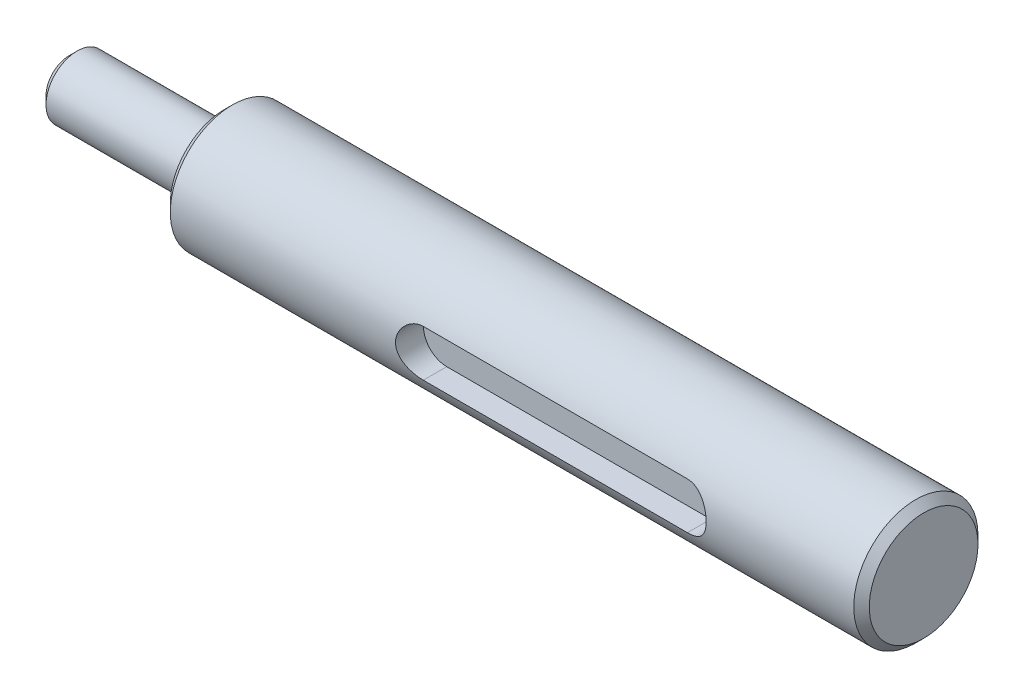
ISO-10303-21;
HEADER;
FILE_DESCRIPTION(('STEP AP214'),'2;1');
FILE_NAME('part.step','',(''),(''),'','','');
FILE_SCHEMA(('AUTOMOTIVE_DESIGN { 1 0 10303 214 1 1 1 1 }'));
ENDSEC;
DATA;
#1=APPLICATION_CONTEXT('core data for automotive mechanical design processes');
#2=APPLICATION_PROTOCOL_DEFINITION('international standard','automotive_design',2000,#1);
#3=PRODUCT_CONTEXT('',#1,'mechanical');
#4=PRODUCT('Part','Part','',(#3));
#5=PRODUCT_RELATED_PRODUCT_CATEGORY('part','',(#4));
#6=PRODUCT_DEFINITION_FORMATION('','',#4);
#7=PRODUCT_DEFINITION_CONTEXT('part definition',#1,'design');
#8=PRODUCT_DEFINITION('design','',#6,#7);
#9=PRODUCT_DEFINITION_SHAPE('','',#8);
#10=(LENGTH_UNIT() NAMED_UNIT(*) SI_UNIT(.MILLI.,.METRE.));
#11=(NAMED_UNIT(*) PLANE_ANGLE_UNIT() SI_UNIT($,.RADIAN.));
#12=(NAMED_UNIT(*) SI_UNIT($,.STERADIAN.) SOLID_ANGLE_UNIT());
#13=UNCERTAINTY_MEASURE_WITH_UNIT(LENGTH_MEASURE(1.E-05),#10,'distance_accuracy_value','');
#14=(GEOMETRIC_REPRESENTATION_CONTEXT(3) GLOBAL_UNCERTAINTY_ASSIGNED_CONTEXT((#13)) GLOBAL_UNIT_ASSIGNED_CONTEXT((#10,
#11,#12)) REPRESENTATION_CONTEXT('',''));
#15=CARTESIAN_POINT('',(0.,0.,0.));
#16=DIRECTION('',(0.,0.,1.));
#17=DIRECTION('',(1.,0.,0.));
#18=AXIS2_PLACEMENT_3D('',#15,#16,#17);
#19=CARTESIAN_POINT('',(-10.,0.,0.));
#20=DIRECTION('',(1.,0.,0.));
#21=DIRECTION('',(0.,0.,-1.));
#22=AXIS2_PLACEMENT_3D('',#19,#20,#21);
#23=PLANE('',#22);
#24=CARTESIAN_POINT('',(-10.,0.,0.));
#25=DIRECTION('',(1.,0.,0.));
#26=DIRECTION('',(0.,0.,-1.));
#27=AXIS2_PLACEMENT_3D('',#24,#25,#26);
#28=CIRCLE('',#27,1.5);
#29=CARTESIAN_POINT('',(-10.,0.,-1.5));
#30=VERTEX_POINT('',#29);
#31=EDGE_CURVE('E209',#30,#30,#28,.T.);
#32=ORIENTED_EDGE('',*,*,#31,.F.);
#33=EDGE_LOOP('',(#32));
#34=FACE_BOUND('',#33,.T.);
#35=ADVANCED_FACE('F16',(#34),#23,.F.);
#36=CARTESIAN_POINT('',(-10.,0.,0.));
#37=DIRECTION('',(1.,0.,0.));
#38=DIRECTION('',(0.,0.,-1.));
#39=AXIS2_PLACEMENT_3D('',#36,#37,#38);
#40=CONICAL_SURFACE('',#39,1.5,0.785398163397448);
#41=CARTESIAN_POINT('',(-9.5,0.,0.));
#42=DIRECTION('',(1.,0.,0.));
#43=DIRECTION('',(0.,0.,-1.));
#44=AXIS2_PLACEMENT_3D('',#41,#42,#43);
#45=CIRCLE('',#44,2.);
#46=CARTESIAN_POINT('',(-9.5,0.,-2.));
#47=VERTEX_POINT('',#46);
#48=EDGE_CURVE('E201',#47,#47,#45,.T.);
#49=ORIENTED_EDGE('',*,*,#48,.F.);
#50=EDGE_LOOP('',(#49));
#51=FACE_BOUND('',#50,.T.);
#52=ORIENTED_EDGE('',*,*,#31,.T.);
#53=EDGE_LOOP('',(#52));
#54=FACE_BOUND('',#53,.T.);
#55=ADVANCED_FACE('F166',(#51,#54),#40,.T.);
#56=CARTESIAN_POINT('',(45.,0.,0.));
#57=DIRECTION('',(1.,0.,0.));
#58=DIRECTION('',(0.,0.,-1.));
#59=AXIS2_PLACEMENT_3D('',#56,#57,#58);
#60=CYLINDRICAL_SURFACE('',#59,2.);
#61=CARTESIAN_POINT('',(-0.2,0.,0.));
#62=DIRECTION('',(1.,0.,0.));
#63=DIRECTION('',(0.,0.,-1.));
#64=AXIS2_PLACEMENT_3D('',#61,#62,#63);
#65=CIRCLE('',#64,2.);
#66=CARTESIAN_POINT('',(-0.2,0.,-2.));
#67=VERTEX_POINT('',#66);
#68=EDGE_CURVE('E197',#67,#67,#65,.T.);
#69=ORIENTED_EDGE('',*,*,#68,.F.);
#70=EDGE_LOOP('',(#69));
#71=FACE_BOUND('',#70,.T.);
#72=ORIENTED_EDGE('',*,*,#48,.T.);
#73=EDGE_LOOP('',(#72));
#74=FACE_BOUND('',#73,.T.);
#75=ADVANCED_FACE('F172',(#71,#74),#60,.T.);
#76=CARTESIAN_POINT('',(-0.200000000000016,0.,0.));
#77=DIRECTION('',(1.,0.,0.));
#78=DIRECTION('',(0.,0.,-1.));
#79=AXIS2_PLACEMENT_3D('',#76,#77,#78);
#80=TOROIDAL_SURFACE('',#79,2.2,0.200000000000016);
#81=CARTESIAN_POINT('',(0.,0.,0.));
#82=DIRECTION('',(1.,0.,0.));
#83=DIRECTION('',(0.,0.,-1.));
#84=AXIS2_PLACEMENT_3D('',#81,#82,#83);
#85=CIRCLE('',#84,2.2);
#86=CARTESIAN_POINT('',(0.,0.,-2.2));
#87=VERTEX_POINT('',#86);
#88=EDGE_CURVE('E196',#87,#87,#85,.T.);
#89=ORIENTED_EDGE('',*,*,#88,.F.);
#90=EDGE_LOOP('',(#89));
#91=FACE_BOUND('',#90,.T.);
#92=ORIENTED_EDGE('',*,*,#68,.T.);
#93=EDGE_LOOP('',(#92));
#94=FACE_BOUND('',#93,.T.);
#95=ADVANCED_FACE('F179',(#91,#94),#80,.F.);
#96=CARTESIAN_POINT('',(0.,2.2,0.));
#97=DIRECTION('',(1.,0.,0.));
#98=DIRECTION('',(0.,0.,-1.));
#99=AXIS2_PLACEMENT_3D('',#96,#97,#98);
#100=PLANE('',#99);
#101=CARTESIAN_POINT('',(0.,0.,0.));
#102=DIRECTION('',(1.,0.,0.));
#103=DIRECTION('',(0.,0.,-1.));
#104=AXIS2_PLACEMENT_3D('',#101,#102,#103);
#105=CIRCLE('',#104,3.5);
#106=CARTESIAN_POINT('',(0.,0.,-3.5));
#107=VERTEX_POINT('',#106);
#108=EDGE_CURVE('E193',#107,#107,#105,.T.);
#109=ORIENTED_EDGE('',*,*,#108,.F.);
#110=EDGE_LOOP('',(#109));
#111=FACE_BOUND('',#110,.T.);
#112=ORIENTED_EDGE('',*,*,#88,.T.);
#113=EDGE_LOOP('',(#112));
#114=FACE_BOUND('',#113,.T.);
#115=ADVANCED_FACE('F182',(#111,#114),#100,.F.);
#116=CARTESIAN_POINT('',(0.,0.,0.));
#117=DIRECTION('',(1.,0.,0.));
#118=DIRECTION('',(0.,0.,-1.));
#119=AXIS2_PLACEMENT_3D('',#116,#117,#118);
#120=CONICAL_SURFACE('',#119,3.5,0.785398163397448);
#121=CARTESIAN_POINT('',(0.5,0.,0.));
#122=DIRECTION('',(1.,0.,0.));
#123=DIRECTION('',(0.,0.,-1.));
#124=AXIS2_PLACEMENT_3D('',#121,#122,#123);
#125=CIRCLE('',#124,4.);
#126=CARTESIAN_POINT('',(0.5,0.,-4.));
#127=VERTEX_POINT('',#126);
#128=EDGE_CURVE('E89',#127,#127,#125,.T.);
#129=ORIENTED_EDGE('',*,*,#128,.F.);
#130=EDGE_LOOP('',(#129));
#131=FACE_BOUND('',#130,.T.);
#132=ORIENTED_EDGE('',*,*,#108,.T.);
#133=EDGE_LOOP('',(#132));
#134=FACE_BOUND('',#133,.T.);
#135=ADVANCED_FACE('F110',(#131,#134),#120,.T.);
#136=CARTESIAN_POINT('',(45.,0.,0.));
#137=DIRECTION('',(1.,0.,0.));
#138=DIRECTION('',(0.,0.,-1.));
#139=AXIS2_PLACEMENT_3D('',#136,#137,#138);
#140=CYLINDRICAL_SURFACE('',#139,4.);
#141=CARTESIAN_POINT('',(44.5,0.,0.));
#142=DIRECTION('',(1.,0.,0.));
#143=DIRECTION('',(0.,0.,-1.));
#144=AXIS2_PLACEMENT_3D('',#141,#142,#143);
#145=CIRCLE('',#144,4.);
#146=CARTESIAN_POINT('',(44.5,0.,-4.));
#147=VERTEX_POINT('',#146);
#148=EDGE_CURVE('E86',#147,#147,#145,.T.);
#149=ORIENTED_EDGE('',*,*,#148,.F.);
#150=EDGE_LOOP('',(#149));
#151=FACE_BOUND('',#150,.T.);
#152=DIRECTION('',(1.,0.,0.));
#153=VECTOR('',#152,1.);
#154=CARTESIAN_POINT('',(16.5,1.5,3.70809924354783));
#155=LINE('',#154,#153);
#156=CARTESIAN_POINT('',(16.5,1.5,3.70809924354783));
#157=VERTEX_POINT('',#156);
#158=CARTESIAN_POINT('',(33.5,1.5,3.70809924354783));
#159=VERTEX_POINT('',#158);
#160=EDGE_CURVE('E70',#157,#159,#155,.T.);
#161=ORIENTED_EDGE('',*,*,#160,.T.);
#162=CARTESIAN_POINT('',(33.5,1.5,3.70809924354783));
#163=CARTESIAN_POINT('',(33.5199450486581,1.50000089736899,3.70809856452194));
#164=CARTESIAN_POINT('',(33.5398904816375,1.49961124737892,3.70825648961619));
#165=CARTESIAN_POINT('',(33.5796340399623,1.49804869432538,3.70888816765675));
#166=CARTESIAN_POINT('',(33.5994323661552,1.49688017499157,3.70936015294496));
#167=CARTESIAN_POINT('',(33.6388825387993,1.49376374507018,3.71061619100091));
#168=CARTESIAN_POINT('',(33.6585346560803,1.4918187913755,3.71139905977317));
#169=CARTESIAN_POINT('',(33.697693113869,1.48715414794438,3.71327064511375));
#170=CARTESIAN_POINT('',(33.7171996639137,1.48443597633218,3.71435876230468));
#171=CARTESIAN_POINT('',(33.7560679004188,1.47822866178049,3.71683348672789));
#172=CARTESIAN_POINT('',(33.7754296059174,1.47473962207196,3.71822005399253));
#173=CARTESIAN_POINT('',(33.8140091478965,1.46699380876062,3.72128291475121));
#174=CARTESIAN_POINT('',(33.8332266930134,1.46273577328565,3.72295968425695));
#175=CARTESIAN_POINT('',(33.8715191427874,1.4534548854513,3.72659278835215));
#176=CARTESIAN_POINT('',(33.8905933400785,1.44842948130874,3.72855005430852));
#177=CARTESIAN_POINT('',(33.9286000094495,1.43761528232262,3.73273305403726));
#178=CARTESIAN_POINT('',(33.9475312683034,1.43182273696508,3.73496010187578));
#179=CARTESIAN_POINT('',(33.985168329086,1.41950699430011,3.73965820034778));
#180=CARTESIAN_POINT('',(34.0038735749353,1.41298229017736,3.74212975289855));
#181=CARTESIAN_POINT('',(34.0408951012299,1.39925302398884,3.74728494647122));
#182=CARTESIAN_POINT('',(34.0592128592872,1.39205202586604,3.7499674647739));
#183=CARTESIAN_POINT('',(34.0954584304663,1.37697300078356,3.75553054686646));
#184=CARTESIAN_POINT('',(34.1133874065149,1.36909749464294,3.75841036585242));
#185=CARTESIAN_POINT('',(34.1488594219785,1.35267293462389,3.7643528053963));
#186=CARTESIAN_POINT('',(34.1664031512844,1.34412523635835,3.76741505516591));
#187=CARTESIAN_POINT('',(34.2011085613983,1.32635906598519,3.77370645233928));
#188=CARTESIAN_POINT('',(34.2182703814861,1.31714084382769,3.7769355374234));
#189=CARTESIAN_POINT('',(34.2522159417151,1.29803631474787,3.7835438408551));
#190=CARTESIAN_POINT('',(34.26899920863,1.28814922738827,3.78692323295133));
#191=CARTESIAN_POINT('',(34.3021918757246,1.26770971937128,3.7938145309543));
#192=CARTESIAN_POINT('',(34.3186001469192,1.25715557808746,3.79732676932226));
#193=CARTESIAN_POINT('',(34.3510463192925,1.23538373386121,3.80446563644074));
#194=CARTESIAN_POINT('',(34.3670824081849,1.22416346725929,3.80809267818527));
#195=CARTESIAN_POINT('',(34.3987478822215,1.20109551185277,3.81543136818895));
#196=CARTESIAN_POINT('',(34.4143760025261,1.18924615383918,3.81914322495519));
#197=CARTESIAN_POINT('',(34.4450895144621,1.16501610604786,3.82660390758159));
#198=CARTESIAN_POINT('',(34.4601770051164,1.15263800487171,3.83035249657578));
#199=CARTESIAN_POINT('',(34.4897984519701,1.12735416450796,3.83786996434399));
#200=CARTESIAN_POINT('',(34.5043342455066,1.11445054116477,3.84163871718287));
#201=CARTESIAN_POINT('',(34.5328542980744,1.08811510673159,3.84918078191495));
#202=CARTESIAN_POINT('',(34.5468397407188,1.07468456901714,3.85295406374682));
#203=CARTESIAN_POINT('',(34.5742605789496,1.04729419068475,3.86048914558244));
#204=CARTESIAN_POINT('',(34.5876964388207,1.03333481686828,3.86425095268487));
#205=CARTESIAN_POINT('',(34.6140197999485,1.00488598186168,3.87174646042746));
#206=CARTESIAN_POINT('',(34.6269069906222,0.990396228849816,3.87548014418909));
#207=CARTESIAN_POINT('',(34.6521347898805,0.960886031135332,3.88290226084419));
#208=CARTESIAN_POINT('',(34.6644742718622,0.94586459734425,3.88659059012124));
#209=CARTESIAN_POINT('',(34.6886081831962,0.915290426695448,3.89390437994279));
#210=CARTESIAN_POINT('',(34.7004006430826,0.899736075080753,3.8975295877787));
#211=CARTESIAN_POINT('',(34.7234416800251,0.868098510736872,3.90469835573684));
#212=CARTESIAN_POINT('',(34.7346875164945,0.852013200770794,3.90824146547409));
#213=CARTESIAN_POINT('',(34.7565513756601,0.819434445163634,3.91520168747571));
#214=CARTESIAN_POINT('',(34.7671704034479,0.802941716594649,3.9186189979541));
#215=CARTESIAN_POINT('',(34.7877224622443,0.769614045226761,3.92530019992182));
#216=CARTESIAN_POINT('',(34.7976584918031,0.752781082748375,3.92856473884158));
#217=CARTESIAN_POINT('',(34.8168425606811,0.718772951170971,3.93492867875656));
#218=CARTESIAN_POINT('',(34.8260927865872,0.701599112488884,3.93802859478895));
#219=CARTESIAN_POINT('',(34.8439026880918,0.666908972708808,3.94405143664559));
#220=CARTESIAN_POINT('',(34.852463650375,0.649393389287445,3.94697468958522));
#221=CARTESIAN_POINT('',(34.8688927450906,0.61401987150133,3.9526320685094));
#222=CARTESIAN_POINT('',(34.8767611844706,0.596162093125522,3.95536627816737));
#223=CARTESIAN_POINT('',(34.8918029152238,0.560104476457852,3.96063319255055));
#224=CARTESIAN_POINT('',(34.8989754689702,0.541904299099427,3.96316568295882));
#225=CARTESIAN_POINT('',(34.9126234327671,0.505162482760767,3.96801652126187));
#226=CARTESIAN_POINT('',(34.9190970133416,0.486620089666016,3.97033430504127));
#227=CARTESIAN_POINT('',(34.9313441359663,0.449194437154995,3.97474286117349));
#228=CARTESIAN_POINT('',(34.9371147247672,0.430310098358728,3.97683267222212));
#229=CARTESIAN_POINT('',(34.9479529129768,0.392214942025615,3.98077077145582));
#230=CARTESIAN_POINT('',(34.9530169322277,0.373002978722608,3.98261782705184));
#231=CARTESIAN_POINT('',(34.9623847321422,0.334431890298367,3.98604177851591));
#232=CARTESIAN_POINT('',(34.9666907415375,0.315073377267811,3.98761946596504));
#233=CARTESIAN_POINT('',(34.9745202346462,0.276269646843665,3.99049518825004));
#234=CARTESIAN_POINT('',(34.9780471733009,0.256825218933224,3.9917944569881));
#235=CARTESIAN_POINT('',(34.9843190743405,0.217853921584761,3.99411060862672));
#236=CARTESIAN_POINT('',(34.9870663519509,0.198327474743152,3.99512832736641));
#237=CARTESIAN_POINT('',(34.991778490505,0.159196116709768,3.99687873484046));
#238=CARTESIAN_POINT('',(34.9937444694046,0.139591358470514,3.99761183080508));
#239=CARTESIAN_POINT('',(34.9968939152741,0.100307414369995,3.99879039637172));
#240=CARTESIAN_POINT('',(34.9980772619261,0.0806282175324005,3.99923582174851));
#241=CARTESIAN_POINT('',(34.9996612789958,0.0411993967179798,3.99983650156494));
#242=CARTESIAN_POINT('',(35.0000605737182,0.0214497097566775,3.99999124595597));
#243=CARTESIAN_POINT('',(35.0000764514507,-0.0181161360870476,4.00000805977239));
#244=CARTESIAN_POINT('',(34.9996904105448,-0.0379322962314546,3.9998691479908));
#245=CARTESIAN_POINT('',(34.9981351879993,-0.0776270725407904,3.99929618608449));
#246=CARTESIAN_POINT('',(34.9969621631572,-0.0975055163973702,3.99886068743215));
#247=CARTESIAN_POINT('',(34.9938416169736,-0.137223090792668,3.99769497621722));
#248=CARTESIAN_POINT('',(34.9918929268459,-0.157062116389304,3.99696431887947));
#249=CARTESIAN_POINT('',(34.9872267080505,-0.196541972565766,3.99521712031409));
#250=CARTESIAN_POINT('',(34.9845128479092,-0.216183296591103,3.99420194332114));
#251=CARTESIAN_POINT('',(34.9783204495627,-0.255262680106333,3.99189464356884));
#252=CARTESIAN_POINT('',(34.9748444385816,-0.274701194029206,3.99060343644653));
#253=CARTESIAN_POINT('',(34.9671323027238,-0.313372246727262,3.98775288734361));
#254=CARTESIAN_POINT('',(34.9628974884008,-0.33260508098722,3.98619400785915));
#255=CARTESIAN_POINT('',(34.9536721935787,-0.370862383722415,3.98281681696109));
#256=CARTESIAN_POINT('',(34.9486818310458,-0.389886884229085,3.98099854604965));
#257=CARTESIAN_POINT('',(34.9379498249106,-0.427725432529754,3.97711116041995));
#258=CARTESIAN_POINT('',(34.9322071519953,-0.446539152938039,3.97504170231701));
#259=CARTESIAN_POINT('',(34.9199750877886,-0.483954473328714,3.97066038210852));
#260=CARTESIAN_POINT('',(34.9134835854342,-0.50255530269457,3.9683478364134));
#261=CARTESIAN_POINT('',(34.8997574579093,-0.539543047472781,3.96348871229549));
#262=CARTESIAN_POINT('',(34.8925197183396,-0.557928677839426,3.96094115814073));
#263=CARTESIAN_POINT('',(34.8773414959637,-0.594405549589216,3.95563170066709));
#264=CARTESIAN_POINT('',(34.8694000780712,-0.612496360254044,3.9528695127492));
#265=CARTESIAN_POINT('',(34.8528674043422,-0.648249633234827,3.94716336986651));
#266=CARTESIAN_POINT('',(34.8442792013246,-0.665913644859606,3.94422027954586));
#267=CARTESIAN_POINT('',(34.8264554507235,-0.700811779758493,3.93816905470476));
#268=CARTESIAN_POINT('',(34.8172220153192,-0.718047076374335,3.93506146609069));
#269=CARTESIAN_POINT('',(34.7981112192282,-0.752089365050631,3.92869710372997));
#270=CARTESIAN_POINT('',(34.7882349737999,-0.768897032077975,3.92544059113624));
#271=CARTESIAN_POINT('',(34.7678415252772,-0.802085862639763,3.91879377204522));
#272=CARTESIAN_POINT('',(34.7573244806554,-0.818467130206,3.91540349870009));
#273=CARTESIAN_POINT('',(34.7356524065632,-0.850805326183809,3.90850405870109));
#274=CARTESIAN_POINT('',(34.7244966335254,-0.866761726994714,3.90499475549921));
#275=CARTESIAN_POINT('',(34.7015502349587,-0.898252885828872,3.89787160362012));
#276=CARTESIAN_POINT('',(34.6897580330447,-0.913786438681743,3.89425750667078));
#277=CARTESIAN_POINT('',(34.6655409008703,-0.944434088717742,3.88693883295457));
#278=CARTESIAN_POINT('',(34.6531136381786,-0.959546269436205,3.88323395321616));
#279=CARTESIAN_POINT('',(34.627672438963,-0.989309289100827,3.87575837909199));
#280=CARTESIAN_POINT('',(34.6146573083014,-1.00395907593639,3.871987561245));
#281=CARTESIAN_POINT('',(34.588139422907,-1.03267729410848,3.86442713168466));
#282=CARTESIAN_POINT('',(34.5746391666374,-1.04674807495339,3.86063768445456));
#283=CARTESIAN_POINT('',(34.54715196937,-1.07430126473969,3.85306114950972));
#284=CARTESIAN_POINT('',(34.533166971937,-1.08778562323666,3.84927410312045));
#285=CARTESIAN_POINT('',(34.5047090660023,-1.11416741510404,3.84172081417597));
#286=CARTESIAN_POINT('',(34.4902373253175,-1.12706610004442,3.83795454398939));
#287=CARTESIAN_POINT('',(34.4608040197574,-1.15227769663887,3.83046066755321));
#288=CARTESIAN_POINT('',(34.4458428688493,-1.16459108279046,3.82673303196849));
#289=CARTESIAN_POINT('',(34.4154289717717,-1.18863359128592,3.81933351452422));
#290=CARTESIAN_POINT('',(34.3999759214246,-1.20036234013546,3.81566166932152));
#291=CARTESIAN_POINT('',(34.368576421583,-1.22323729974505,3.80839006097582));
#292=CARTESIAN_POINT('',(34.3526290012407,-1.23438223123663,3.80479046598179));
#293=CARTESIAN_POINT('',(34.3202387020509,-1.25609112912262,3.79767903037953));
#294=CARTESIAN_POINT('',(34.3037942502823,-1.26665286663717,3.79416755112899));
#295=CARTESIAN_POINT('',(34.2704103848882,-1.28719699769113,3.78724728210048));
#296=CARTESIAN_POINT('',(34.2534689222676,-1.2971762608498,3.78383908744704));
#297=CARTESIAN_POINT('',(34.2192247413795,-1.31647638577798,3.77716744893967));
#298=CARTESIAN_POINT('',(34.201922662223,-1.32579830211568,3.77390377651309));
#299=CARTESIAN_POINT('',(34.1670349489381,-1.3437262453162,3.76755753365013));
#300=CARTESIAN_POINT('',(34.149451249596,-1.3523357326521,3.76447411213181));
#301=CARTESIAN_POINT('',(34.1139987115551,-1.36883818369329,3.75850485354708));
#302=CARTESIAN_POINT('',(34.0961311694597,-1.37673368203501,3.75561832726538));
#303=CARTESIAN_POINT('',(34.0601088391496,-1.39180678831751,3.7500584353093));
#304=CARTESIAN_POINT('',(34.0419547469106,-1.39898589533773,3.74738462699791));
#305=CARTESIAN_POINT('',(34.0053573089996,-1.41262495386334,3.74226452584361));
#306=CARTESIAN_POINT('',(33.9869141141335,-1.41908526695052,3.73981811871176));
#307=CARTESIAN_POINT('',(33.9497363434258,-1.43128512703357,3.73516606971231));
#308=CARTESIAN_POINT('',(33.9310014487813,-1.43702381258892,3.73296071600434));
#309=CARTESIAN_POINT('',(33.8932381684067,-1.44777906926282,3.72880263679225));
#310=CARTESIAN_POINT('',(33.8742090874566,-1.45279349121153,3.72685066483768));
#311=CARTESIAN_POINT('',(33.8358548924361,-1.46209677665177,3.72321072599105));
#312=CARTESIAN_POINT('',(33.8165288125707,-1.46638215334576,3.72152403058298));
#313=CARTESIAN_POINT('',(33.7775904911469,-1.47422803480183,3.71842299352297));
#314=CARTESIAN_POINT('',(33.7579772385128,-1.47778417267152,3.71701029522605));
#315=CARTESIAN_POINT('',(33.7186194761666,-1.48411781325269,3.71448596230769));
#316=CARTESIAN_POINT('',(33.6988750636707,-1.48689583835951,3.71337412571621));
#317=CARTESIAN_POINT('',(33.659306602124,-1.49165778414401,3.71146380638784));
#318=CARTESIAN_POINT('',(33.6394827236396,-1.49364292730046,3.7106648412979));
#319=CARTESIAN_POINT('',(33.5997555254359,-1.49682013108245,3.70938439685059));
#320=CARTESIAN_POINT('',(33.5798521844114,-1.49801196231125,3.70890300932537));
#321=CARTESIAN_POINT('',(33.5399659296075,-1.4996032574204,3.70825972258939));
#322=CARTESIAN_POINT('',(33.5199829367162,-1.50000101677856,3.70809851065828));
#323=CARTESIAN_POINT('',(33.5,-1.5,3.70809924354783));
#324=B_SPLINE_CURVE_WITH_KNOTS('',3,(#162,#163,#164,#165,#166,#167,#168,#169,#170,#171,#172,
#173,#174,#175,#176,#177,#178,#179,#180,#181,#182,#183,#184,#185,#186,#187,#188,#189,#190,#191,
#192,#193,#194,#195,#196,#197,#198,#199,#200,#201,#202,#203,#204,#205,#206,#207,#208,#209,#210,
#211,#212,#213,#214,#215,#216,#217,#218,#219,#220,#221,#222,#223,#224,#225,#226,#227,#228,#229,
#230,#231,#232,#233,#234,#235,#236,#237,#238,#239,#240,#241,#242,#243,#244,#245,#246,#247,#248,
#249,#250,#251,#252,#253,#254,#255,#256,#257,#258,#259,#260,#261,#262,#263,#264,#265,#266,#267,
#268,#269,#270,#271,#272,#273,#274,#275,#276,#277,#278,#279,#280,#281,#282,#283,#284,#285,#286,
#287,#288,#289,#290,#291,#292,#293,#294,#295,#296,#297,#298,#299,#300,#301,#302,#303,#304,#305,
#306,#307,#308,#309,#310,#311,#312,#313,#314,#315,#316,#317,#318,#319,#320,#321,#322,#323),
.UNSPECIFIED.,.F.,.F.,(4,2,2,2,2,2,2,2,2,2,2,2,2,2,2,2,2,2,2,2,2,2,2,2,2,2,2,2,2,2,2,2,2,2,2,2,
2,2,2,2,2,2,2,2,2,2,2,2,2,2,2,2,2,2,2,2,2,2,2,2,2,2,2,2,2,2,2,2,2,2,2,2,2,2,2,2,2,2,2,2,4),(0.,
0.0598312333103517,0.119328528938099,0.17860137031588,0.237758630163387,0.296907972750733,
0.356155272355754,0.415604063396811,0.475355035969799,0.535231315669117,0.594808090567642,
0.6541711910058,0.713417501185492,0.772641838290555,0.831936512156359,0.891390923492462,
0.951091208648317,1.01095869623459,1.07056075829167,1.12994285805385,1.18918936136678,
1.24838473383039,1.30761318096651,1.36695829052458,1.42650268446661,1.48631999630579,
1.54603862825969,1.60547567164327,1.66471423909523,1.72383952711829,1.78293847560562,
1.84209939879477,1.90141159514039,1.96096494457237,2.02080986689141,2.08047577982744,
2.13987152952181,2.19908901084421,2.25822145044738,2.31736297865517,2.37660818402172,
2.43605166097448,2.49578756129003,2.55561381554401,2.61515797905046,2.67450760758544,
2.7337557025429,2.79299455643119,2.85231532451712,2.91180761362997,2.9715590971528,
3.03139120790122,3.09095675188133,3.15033569828945,3.20961423684283,3.2688781745824,
3.32821256471929,3.38770134582774,3.44742699890183,3.50727996874194,3.56685958798459,
3.6262230343174,3.68545299716065,3.74463409384541,3.80385252602292,3.86319571190261,
3.92275190194718,3.98260322942064,4.04235624477203,4.10179951806687,4.16102272714834,
4.22011928926929,4.27918598777651,4.33832254076978,4.39763112016236,4.45721583208633,
4.51714755634882,4.57703894775652,4.63683763780492,4.69665361194096,4.7565978471323),.UNSPECIFIED.);
#325=CARTESIAN_POINT('',(33.5,-1.5,3.70809924354783));
#326=VERTEX_POINT('',#325);
#327=EDGE_CURVE('E58',#159,#326,#324,.T.);
#328=ORIENTED_EDGE('',*,*,#327,.T.);
#329=DIRECTION('',(-1.,0.,0.));
#330=VECTOR('',#329,1.);
#331=CARTESIAN_POINT('',(33.5,-1.5,3.70809924354783));
#332=LINE('',#331,#330);
#333=CARTESIAN_POINT('',(16.5,-1.5,3.70809924354783));
#334=VERTEX_POINT('',#333);
#335=EDGE_CURVE('E69',#326,#334,#332,.T.);
#336=ORIENTED_EDGE('',*,*,#335,.T.);
#337=CARTESIAN_POINT('',(16.5,-1.5,3.70809924354783));
#338=CARTESIAN_POINT('',(16.4800549513419,-1.50000089736899,3.70809856452194));
#339=CARTESIAN_POINT('',(16.4601095183624,-1.49961124737892,3.70825648961619));
#340=CARTESIAN_POINT('',(16.4203659600377,-1.49804869432538,3.70888816765675));
#341=CARTESIAN_POINT('',(16.4005676338448,-1.49688017499157,3.70936015294496));
#342=CARTESIAN_POINT('',(16.3611174612007,-1.49376374507018,3.71061619100091));
#343=CARTESIAN_POINT('',(16.3414653439197,-1.4918187913755,3.71139905977317));
#344=CARTESIAN_POINT('',(16.302306886131,-1.48715414794438,3.71327064511376));
#345=CARTESIAN_POINT('',(16.2828003360863,-1.48443597633218,3.71435876230468));
#346=CARTESIAN_POINT('',(16.2439320995812,-1.47822866178049,3.71683348672789));
#347=CARTESIAN_POINT('',(16.2245703940826,-1.47473962207196,3.71822005399253));
#348=CARTESIAN_POINT('',(16.1859908521035,-1.46699380876062,3.72128291475121));
#349=CARTESIAN_POINT('',(16.1667733069865,-1.46273577328565,3.72295968425695));
#350=CARTESIAN_POINT('',(16.1284808572126,-1.4534548854513,3.72659278835215));
#351=CARTESIAN_POINT('',(16.1094066599215,-1.44842948130874,3.72855005430852));
#352=CARTESIAN_POINT('',(16.0713999905505,-1.43761528232262,3.73273305403726));
#353=CARTESIAN_POINT('',(16.0524687316965,-1.43182273696509,3.73496010187578));
#354=CARTESIAN_POINT('',(16.014831670914,-1.41950699430011,3.73965820034778));
#355=CARTESIAN_POINT('',(15.9961264250647,-1.41298229017735,3.74212975289855));
#356=CARTESIAN_POINT('',(15.9591048987701,-1.39925302398883,3.74728494647122));
#357=CARTESIAN_POINT('',(15.9407871407128,-1.39205202586604,3.7499674647739));
#358=CARTESIAN_POINT('',(15.9045415695337,-1.37697300078356,3.75553054686646));
#359=CARTESIAN_POINT('',(15.8866125934851,-1.36909749464294,3.75841036585242));
#360=CARTESIAN_POINT('',(15.8511405780215,-1.35267293462389,3.7643528053963));
#361=CARTESIAN_POINT('',(15.8335968487156,-1.34412523635834,3.76741505516591));
#362=CARTESIAN_POINT('',(15.7988914386017,-1.32635906598519,3.77370645233929));
#363=CARTESIAN_POINT('',(15.7817296185139,-1.31714084382769,3.7769355374234));
#364=CARTESIAN_POINT('',(15.7477840582849,-1.29803631474788,3.7835438408551));
#365=CARTESIAN_POINT('',(15.73100079137,-1.28814922738827,3.78692323295133));
#366=CARTESIAN_POINT('',(15.6978081242753,-1.26770971937128,3.7938145309543));
#367=CARTESIAN_POINT('',(15.6813998530808,-1.25715557808746,3.79732676932226));
#368=CARTESIAN_POINT('',(15.6489536807075,-1.23538373386121,3.80446563644074));
#369=CARTESIAN_POINT('',(15.6329175918151,-1.22416346725929,3.80809267818527));
#370=CARTESIAN_POINT('',(15.6012521177784,-1.20109551185277,3.81543136818895));
#371=CARTESIAN_POINT('',(15.5856239974739,-1.18924615383918,3.81914322495518));
#372=CARTESIAN_POINT('',(15.5549104855379,-1.16501610604787,3.82660390758158));
#373=CARTESIAN_POINT('',(15.5398229948836,-1.15263800487171,3.83035249657578));
#374=CARTESIAN_POINT('',(15.5102015480299,-1.12735416450796,3.83786996434399));
#375=CARTESIAN_POINT('',(15.4956657544934,-1.11445054116477,3.84163871718287));
#376=CARTESIAN_POINT('',(15.4671457019255,-1.08811510673159,3.84918078191495));
#377=CARTESIAN_POINT('',(15.4531602592812,-1.07468456901714,3.85295406374682));
#378=CARTESIAN_POINT('',(15.4257394210504,-1.04729419068475,3.86048914558244));
#379=CARTESIAN_POINT('',(15.4123035611793,-1.03333481686828,3.86425095268487));
#380=CARTESIAN_POINT('',(15.3859802000515,-1.00488598186168,3.87174646042746));
#381=CARTESIAN_POINT('',(15.3730930093778,-0.990396228849816,3.87548014418909));
#382=CARTESIAN_POINT('',(15.3478652101195,-0.960886031135329,3.88290226084419));
#383=CARTESIAN_POINT('',(15.3355257281378,-0.945864597344244,3.88659059012124));
#384=CARTESIAN_POINT('',(15.3113918168038,-0.915290426695439,3.89390437994279));
#385=CARTESIAN_POINT('',(15.2995993569174,-0.899736075080744,3.8975295877787));
#386=CARTESIAN_POINT('',(15.276558319975,-0.868098510736867,3.90469835573684));
#387=CARTESIAN_POINT('',(15.2653124835055,-0.852013200770793,3.90824146547409));
#388=CARTESIAN_POINT('',(15.2434486243399,-0.81943444516363,3.91520168747571));
#389=CARTESIAN_POINT('',(15.2328295965522,-0.802941716594639,3.9186189979541));
#390=CARTESIAN_POINT('',(15.2122775377557,-0.769614045226749,3.92530019992182));
#391=CARTESIAN_POINT('',(15.2023415081969,-0.752781082748366,3.92856473884158));
#392=CARTESIAN_POINT('',(15.1831574393189,-0.718772951170964,3.93492867875656));
#393=CARTESIAN_POINT('',(15.1739072134128,-0.701599112488877,3.93802859478896));
#394=CARTESIAN_POINT('',(15.1560973119082,-0.666908972708803,3.94405143664559));
#395=CARTESIAN_POINT('',(15.147536349625,-0.649393389287443,3.94697468958522));
#396=CARTESIAN_POINT('',(15.1311072549094,-0.614019871501331,3.9526320685094));
#397=CARTESIAN_POINT('',(15.1232388155294,-0.596162093125523,3.95536627816737));
#398=CARTESIAN_POINT('',(15.1081970847762,-0.560104476457853,3.96063319255055));
#399=CARTESIAN_POINT('',(15.1010245310298,-0.541904299099428,3.96316568295882));
#400=CARTESIAN_POINT('',(15.0873765672329,-0.505162482760769,3.96801652126187));
#401=CARTESIAN_POINT('',(15.0809029866584,-0.486620089666019,3.97033430504127));
#402=CARTESIAN_POINT('',(15.0686558640337,-0.449194437154999,3.97474286117349));
#403=CARTESIAN_POINT('',(15.0628852752328,-0.430310098358732,3.97683267222212));
#404=CARTESIAN_POINT('',(15.0520470870232,-0.39221494202562,3.98077077145582));
#405=CARTESIAN_POINT('',(15.0469830677723,-0.373002978722613,3.98261782705183));
#406=CARTESIAN_POINT('',(15.0376152678578,-0.334431890298374,3.98604177851591));
#407=CARTESIAN_POINT('',(15.0333092584625,-0.315073377267818,3.98761946596504));
#408=CARTESIAN_POINT('',(15.0254797653538,-0.27626964684367,3.99049518825004));
#409=CARTESIAN_POINT('',(15.0219528266991,-0.256825218933226,3.9917944569881));
#410=CARTESIAN_POINT('',(15.0156809256595,-0.217853921584762,3.99411060862672));
#411=CARTESIAN_POINT('',(15.0129336480491,-0.198327474743155,3.99512832736641));
#412=CARTESIAN_POINT('',(15.008221509495,-0.159196116709772,3.99687873484046));
#413=CARTESIAN_POINT('',(15.0062555305954,-0.139591358470517,3.99761183080508));
#414=CARTESIAN_POINT('',(15.0031060847259,-0.100307414369998,3.99879039637172));
#415=CARTESIAN_POINT('',(15.0019227380739,-0.0806282175324042,3.99923582174851));
#416=CARTESIAN_POINT('',(15.0003387210042,-0.0411993967179831,3.99983650156494));
#417=CARTESIAN_POINT('',(14.9999394262818,-0.0214497097566795,3.99999124595597));
#418=CARTESIAN_POINT('',(14.9999235485493,0.0181161360870457,4.00000805977239));
#419=CARTESIAN_POINT('',(15.0003095894552,0.0379322962314514,3.9998691479908));
#420=CARTESIAN_POINT('',(15.0018648120007,0.0776270725407867,3.99929618608449));
#421=CARTESIAN_POINT('',(15.0030378368428,0.0975055163973671,3.99886068743215));
#422=CARTESIAN_POINT('',(15.0061583830264,0.137223090792665,3.99769497621722));
#423=CARTESIAN_POINT('',(15.0081070731541,0.1570621163893,3.99696431887947));
#424=CARTESIAN_POINT('',(15.0127732919495,0.196541972565761,3.99521712031409));
#425=CARTESIAN_POINT('',(15.0154871520908,0.216183296591099,3.99420194332114));
#426=CARTESIAN_POINT('',(15.0216795504373,0.255262680106331,3.99189464356884));
#427=CARTESIAN_POINT('',(15.0251555614184,0.274701194029205,3.99060343644653));
#428=CARTESIAN_POINT('',(15.0328676972762,0.313372246727261,3.98775288734361));
#429=CARTESIAN_POINT('',(15.0371025115992,0.332605080987217,3.98619400785915));
#430=CARTESIAN_POINT('',(15.0463278064213,0.370862383722412,3.98281681696109));
#431=CARTESIAN_POINT('',(15.0513181689542,0.389886884229084,3.98099854604965));
#432=CARTESIAN_POINT('',(15.0620501750894,0.427725432529754,3.97711116041995));
#433=CARTESIAN_POINT('',(15.0677928480047,0.446539152938038,3.97504170231701));
#434=CARTESIAN_POINT('',(15.0800249122114,0.483954473328713,3.97066038210852));
#435=CARTESIAN_POINT('',(15.0865164145658,0.502555302694569,3.9683478364134));
#436=CARTESIAN_POINT('',(15.1002425420906,0.539543047472782,3.96348871229549));
#437=CARTESIAN_POINT('',(15.1074802816603,0.557928677839428,3.96094115814073));
#438=CARTESIAN_POINT('',(15.1226585040362,0.594405549589217,3.95563170066709));
#439=CARTESIAN_POINT('',(15.1305999219288,0.612496360254044,3.9528695127492));
#440=CARTESIAN_POINT('',(15.1471325956578,0.648249633234826,3.94716336986651));
#441=CARTESIAN_POINT('',(15.1557207986754,0.665913644859606,3.94422027954586));
#442=CARTESIAN_POINT('',(15.1735445492765,0.700811779758497,3.93816905470476));
#443=CARTESIAN_POINT('',(15.1827779846808,0.71804707637434,3.93506146609069));
#444=CARTESIAN_POINT('',(15.2018887807718,0.752089365050638,3.92869710372997));
#445=CARTESIAN_POINT('',(15.2117650262001,0.768897032077981,3.92544059113624));
#446=CARTESIAN_POINT('',(15.2321584747228,0.802085862639768,3.91879377204522));
#447=CARTESIAN_POINT('',(15.2426755193446,0.818467130206004,3.91540349870009));
#448=CARTESIAN_POINT('',(15.2643475934368,0.850805326183813,3.90850405870109));
#449=CARTESIAN_POINT('',(15.2755033664746,0.866761726994717,3.90499475549921));
#450=CARTESIAN_POINT('',(15.2984497650413,0.898252885828876,3.89787160362012));
#451=CARTESIAN_POINT('',(15.3102419669553,0.913786438681748,3.89425750667078));
#452=CARTESIAN_POINT('',(15.3344590991297,0.944434088717749,3.88693883295456));
#453=CARTESIAN_POINT('',(15.3468863618214,0.959546269436214,3.88323395321616));
#454=CARTESIAN_POINT('',(15.372327561037,0.989309289100836,3.87575837909199));
#455=CARTESIAN_POINT('',(15.3853426916986,1.00395907593639,3.871987561245));
#456=CARTESIAN_POINT('',(15.411860577093,1.03267729410848,3.86442713168466));
#457=CARTESIAN_POINT('',(15.4253608333626,1.0467480749534,3.86063768445455));
#458=CARTESIAN_POINT('',(15.45284803063,1.0743012647397,3.85306114950972));
#459=CARTESIAN_POINT('',(15.466833028063,1.08778562323667,3.84927410312045));
#460=CARTESIAN_POINT('',(15.4952909339977,1.11416741510405,3.84172081417596));
#461=CARTESIAN_POINT('',(15.5097626746825,1.12706610004442,3.83795454398939));
#462=CARTESIAN_POINT('',(15.5391959802426,1.15227769663887,3.83046066755321));
#463=CARTESIAN_POINT('',(15.5541571311507,1.16459108279046,3.82673303196849));
#464=CARTESIAN_POINT('',(15.5845710282283,1.18863359128592,3.81933351452421));
#465=CARTESIAN_POINT('',(15.6000240785754,1.20036234013547,3.81566166932152));
#466=CARTESIAN_POINT('',(15.631423578417,1.22323729974506,3.80839006097582));
#467=CARTESIAN_POINT('',(15.6473709987593,1.23438223123663,3.80479046598179));
#468=CARTESIAN_POINT('',(15.6797612979491,1.25609112912262,3.79767903037953));
#469=CARTESIAN_POINT('',(15.6962057497177,1.26665286663717,3.79416755112899));
#470=CARTESIAN_POINT('',(15.7295896151118,1.28719699769113,3.78724728210047));
#471=CARTESIAN_POINT('',(15.7465310777324,1.2971762608498,3.78383908744704));
#472=CARTESIAN_POINT('',(15.7807752586205,1.31647638577798,3.77716744893967));
#473=CARTESIAN_POINT('',(15.798077337777,1.32579830211567,3.77390377651309));
#474=CARTESIAN_POINT('',(15.8329650510619,1.3437262453162,3.76755753365013));
#475=CARTESIAN_POINT('',(15.850548750404,1.3523357326521,3.76447411213181));
#476=CARTESIAN_POINT('',(15.8860012884449,1.36883818369329,3.75850485354708));
#477=CARTESIAN_POINT('',(15.9038688305403,1.37673368203501,3.75561832726538));
#478=CARTESIAN_POINT('',(15.9398911608504,1.39180678831751,3.7500584353093));
#479=CARTESIAN_POINT('',(15.9580452530894,1.39898589533774,3.74738462699791));
#480=CARTESIAN_POINT('',(15.9946426910004,1.41262495386334,3.74226452584361));
#481=CARTESIAN_POINT('',(16.0130858858665,1.41908526695052,3.73981811871176));
#482=CARTESIAN_POINT('',(16.0502636565742,1.43128512703357,3.73516606971231));
#483=CARTESIAN_POINT('',(16.0689985512186,1.43702381258892,3.73296071600434));
#484=CARTESIAN_POINT('',(16.1067618315933,1.44777906926282,3.72880263679225));
#485=CARTESIAN_POINT('',(16.1257909125434,1.45279349121153,3.72685066483768));
#486=CARTESIAN_POINT('',(16.1641451075639,1.46209677665177,3.72321072599104));
#487=CARTESIAN_POINT('',(16.1834711874293,1.46638215334576,3.72152403058298));
#488=CARTESIAN_POINT('',(16.2224095088531,1.47422803480183,3.71842299352297));
#489=CARTESIAN_POINT('',(16.2420227614872,1.47778417267152,3.71701029522605));
#490=CARTESIAN_POINT('',(16.2813805238334,1.48411781325269,3.71448596230769));
#491=CARTESIAN_POINT('',(16.3011249363293,1.48689583835951,3.7133741257162));
#492=CARTESIAN_POINT('',(16.340693397876,1.49165778414402,3.71146380638784));
#493=CARTESIAN_POINT('',(16.3605172763604,1.49364292730046,3.7106648412979));
#494=CARTESIAN_POINT('',(16.4002444745641,1.49682013108245,3.70938439685059));
#495=CARTESIAN_POINT('',(16.4201478155886,1.49801196231125,3.70890300932537));
#496=CARTESIAN_POINT('',(16.4600340703925,1.4996032574204,3.70825972258939));
#497=CARTESIAN_POINT('',(16.4800170632838,1.50000101677856,3.70809851065828));
#498=CARTESIAN_POINT('',(16.5,1.5,3.70809924354783));
#499=B_SPLINE_CURVE_WITH_KNOTS('',3,(#337,#338,#339,#340,#341,#342,#343,#344,#345,#346,#347,
#348,#349,#350,#351,#352,#353,#354,#355,#356,#357,#358,#359,#360,#361,#362,#363,#364,#365,#366,
#367,#368,#369,#370,#371,#372,#373,#374,#375,#376,#377,#378,#379,#380,#381,#382,#383,#384,#385,
#386,#387,#388,#389,#390,#391,#392,#393,#394,#395,#396,#397,#398,#399,#400,#401,#402,#403,#404,
#405,#406,#407,#408,#409,#410,#411,#412,#413,#414,#415,#416,#417,#418,#419,#420,#421,#422,#423,
#424,#425,#426,#427,#428,#429,#430,#431,#432,#433,#434,#435,#436,#437,#438,#439,#440,#441,#442,
#443,#444,#445,#446,#447,#448,#449,#450,#451,#452,#453,#454,#455,#456,#457,#458,#459,#460,#461,
#462,#463,#464,#465,#466,#467,#468,#469,#470,#471,#472,#473,#474,#475,#476,#477,#478,#479,#480,
#481,#482,#483,#484,#485,#486,#487,#488,#489,#490,#491,#492,#493,#494,#495,#496,#497,#498),
.UNSPECIFIED.,.F.,.F.,(4,2,2,2,2,2,2,2,2,2,2,2,2,2,2,2,2,2,2,2,2,2,2,2,2,2,2,2,2,2,2,2,2,2,2,2,
2,2,2,2,2,2,2,2,2,2,2,2,2,2,2,2,2,2,2,2,2,2,2,2,2,2,2,2,2,2,2,2,2,2,2,2,2,2,2,2,2,2,2,2,4),(0.,
0.0598312333103586,0.119328528938103,0.178601370315884,0.237758630163391,0.296907972750744,
0.356155272355761,0.415604063396815,0.47535503596981,0.535231315669118,0.594808090567649,
0.654171191005805,0.713417501185495,0.772641838290563,0.831936512156368,0.891390923492471,
0.95109120864832,1.01095869623459,1.07056075829168,1.12994285805386,1.18918936136679,
1.2483847338304,1.30761318096652,1.36695829052459,1.42650268446661,1.4863199963058,
1.5460386282597,1.60547567164327,1.66471423909523,1.72383952711829,1.78293847560562,
1.84209939879477,1.90141159514039,1.96096494457237,2.02080986689141,2.08047577982743,
2.13987152952182,2.19908901084421,2.25822145044738,2.31736297865517,2.37660818402172,
2.43605166097448,2.49578756129003,2.55561381554401,2.61515797905046,2.67450760758545,
2.7337557025429,2.79299455643119,2.85231532451712,2.91180761362997,2.9715590971528,
3.03139120790122,3.09095675188134,3.15033569828946,3.20961423684283,3.26887817458241,
3.3282125647193,3.38770134582775,3.44742699890184,3.50727996874196,3.5668595879846,
3.62622303431741,3.68545299716065,3.74463409384541,3.80385252602292,3.86319571190262,
3.92275190194718,3.98260322942065,4.04235624477203,4.10179951806688,4.16102272714835,
4.2201192892693,4.27918598777651,4.33832254076978,4.39763112016236,4.45721583208633,
4.51714755634882,4.57703894775653,4.63683763780492,4.69665361194097,4.75659784713231),.UNSPECIFIED.);
#500=EDGE_CURVE('E84',#334,#157,#499,.T.);
#501=ORIENTED_EDGE('',*,*,#500,.T.);
#502=EDGE_LOOP('',(#161,#328,#336,#501));
#503=FACE_BOUND('',#502,.T.);
#504=ORIENTED_EDGE('',*,*,#128,.T.);
#505=EDGE_LOOP('',(#504));
#506=FACE_BOUND('',#505,.T.);
#507=ADVANCED_FACE('F82',(#151,#503,#506),#140,.T.);
#508=CARTESIAN_POINT('',(44.5,0.,0.));
#509=DIRECTION('',(-1.,0.,0.));
#510=DIRECTION('',(0.,0.,1.));
#511=AXIS2_PLACEMENT_3D('',#508,#509,#510);
#512=CONICAL_SURFACE('',#511,4.,0.785398163397448);
#513=CARTESIAN_POINT('',(45.,0.,0.));
#514=DIRECTION('',(1.,0.,0.));
#515=DIRECTION('',(0.,0.,-1.));
#516=AXIS2_PLACEMENT_3D('',#513,#514,#515);
#517=CIRCLE('',#516,3.5);
#518=CARTESIAN_POINT('',(45.,0.,-3.5));
#519=VERTEX_POINT('',#518);
#520=EDGE_CURVE('E119',#519,#519,#517,.T.);
#521=ORIENTED_EDGE('',*,*,#520,.F.);
#522=EDGE_LOOP('',(#521));
#523=FACE_BOUND('',#522,.T.);
#524=ORIENTED_EDGE('',*,*,#148,.T.);
#525=EDGE_LOOP('',(#524));
#526=FACE_BOUND('',#525,.T.);
#527=ADVANCED_FACE('F109',(#523,#526),#512,.T.);
#528=CARTESIAN_POINT('',(33.5,1.5,2.2));
#529=DIRECTION('',(0.,1.,0.));
#530=DIRECTION('',(0.,0.,1.));
#531=AXIS2_PLACEMENT_3D('',#528,#529,#530);
#532=PLANE('',#531);
#533=DIRECTION('',(0.,0.,1.));
#534=VECTOR('',#533,1.);
#535=CARTESIAN_POINT('',(16.5,1.5,2.2));
#536=LINE('',#535,#534);
#537=CARTESIAN_POINT('',(16.5,1.5,2.2));
#538=VERTEX_POINT('',#537);
#539=EDGE_CURVE('E127',#538,#157,#536,.T.);
#540=ORIENTED_EDGE('',*,*,#539,.F.);
#541=DIRECTION('',(-1.,0.,0.));
#542=VECTOR('',#541,1.);
#543=CARTESIAN_POINT('',(33.5,1.5,2.2));
#544=LINE('',#543,#542);
#545=CARTESIAN_POINT('',(33.5,1.5,2.2));
#546=VERTEX_POINT('',#545);
#547=EDGE_CURVE('E78',#546,#538,#544,.T.);
#548=ORIENTED_EDGE('',*,*,#547,.F.);
#549=DIRECTION('',(0.,0.,1.));
#550=VECTOR('',#549,1.);
#551=CARTESIAN_POINT('',(33.5,1.5,2.2));
#552=LINE('',#551,#550);
#553=EDGE_CURVE('E62',#546,#159,#552,.T.);
#554=ORIENTED_EDGE('',*,*,#553,.T.);
#555=ORIENTED_EDGE('',*,*,#160,.F.);
#556=EDGE_LOOP('',(#540,#548,#554,#555));
#557=FACE_BOUND('',#556,.T.);
#558=ADVANCED_FACE('F77',(#557),#532,.F.);
#559=CARTESIAN_POINT('',(33.5,0.,2.2));
#560=DIRECTION('',(0.,0.,1.));
#561=DIRECTION('',(1.,0.,0.));
#562=AXIS2_PLACEMENT_3D('',#559,#560,#561);
#563=CYLINDRICAL_SURFACE('',#562,1.5);
#564=ORIENTED_EDGE('',*,*,#553,.F.);
#565=CARTESIAN_POINT('',(33.5,0.,2.2));
#566=DIRECTION('',(0.,0.,1.));
#567=DIRECTION('',(0.,-1.,0.));
#568=AXIS2_PLACEMENT_3D('',#565,#566,#567);
#569=CIRCLE('',#568,1.5);
#570=CARTESIAN_POINT('',(33.5,-1.5,2.2));
#571=VERTEX_POINT('',#570);
#572=EDGE_CURVE('E79',#571,#546,#569,.T.);
#573=ORIENTED_EDGE('',*,*,#572,.F.);
#574=DIRECTION('',(0.,0.,1.));
#575=VECTOR('',#574,1.);
#576=CARTESIAN_POINT('',(33.5,-1.5,2.2));
#577=LINE('',#576,#575);
#578=EDGE_CURVE('E64',#571,#326,#577,.T.);
#579=ORIENTED_EDGE('',*,*,#578,.T.);
#580=ORIENTED_EDGE('',*,*,#327,.F.);
#581=EDGE_LOOP('',(#564,#573,#579,#580));
#582=FACE_BOUND('',#581,.T.);
#583=ADVANCED_FACE('F61',(#582),#563,.F.);
#584=CARTESIAN_POINT('',(16.5,-1.5,2.2));
#585=DIRECTION('',(0.,-1.,0.));
#586=DIRECTION('',(0.,0.,-1.));
#587=AXIS2_PLACEMENT_3D('',#584,#585,#586);
#588=PLANE('',#587);
#589=ORIENTED_EDGE('',*,*,#578,.F.);
#590=DIRECTION('',(1.,0.,0.));
#591=VECTOR('',#590,1.);
#592=CARTESIAN_POINT('',(16.5,-1.5,2.2));
#593=LINE('',#592,#591);
#594=CARTESIAN_POINT('',(16.5,-1.5,2.2));
#595=VERTEX_POINT('',#594);
#596=EDGE_CURVE('E37',#595,#571,#593,.T.);
#597=ORIENTED_EDGE('',*,*,#596,.F.);
#598=DIRECTION('',(0.,0.,1.));
#599=VECTOR('',#598,1.);
#600=CARTESIAN_POINT('',(16.5,-1.5,2.2));
#601=LINE('',#600,#599);
#602=EDGE_CURVE('E27',#595,#334,#601,.T.);
#603=ORIENTED_EDGE('',*,*,#602,.T.);
#604=ORIENTED_EDGE('',*,*,#335,.F.);
#605=EDGE_LOOP('',(#589,#597,#603,#604));
#606=FACE_BOUND('',#605,.T.);
#607=ADVANCED_FACE('F156',(#606),#588,.F.);
#608=CARTESIAN_POINT('',(16.5,0.,2.2));
#609=DIRECTION('',(0.,0.,1.));
#610=DIRECTION('',(1.,0.,0.));
#611=AXIS2_PLACEMENT_3D('',#608,#609,#610);
#612=CYLINDRICAL_SURFACE('',#611,1.5);
#613=ORIENTED_EDGE('',*,*,#602,.F.);
#614=CARTESIAN_POINT('',(16.5,0.,2.2));
#615=DIRECTION('',(0.,0.,1.));
#616=DIRECTION('',(0.,1.,0.));
#617=AXIS2_PLACEMENT_3D('',#614,#615,#616);
#618=CIRCLE('',#617,1.5);
#619=EDGE_CURVE('E11',#538,#595,#618,.T.);
#620=ORIENTED_EDGE('',*,*,#619,.F.);
#621=ORIENTED_EDGE('',*,*,#539,.T.);
#622=ORIENTED_EDGE('',*,*,#500,.F.);
#623=EDGE_LOOP('',(#613,#620,#621,#622));
#624=FACE_BOUND('',#623,.T.);
#625=ADVANCED_FACE('F154',(#624),#612,.F.);
#626=CARTESIAN_POINT('',(45.,3.5,0.));
#627=DIRECTION('',(-1.,0.,0.));
#628=DIRECTION('',(0.,0.,1.));
#629=AXIS2_PLACEMENT_3D('',#626,#627,#628);
#630=PLANE('',#629);
#631=ORIENTED_EDGE('',*,*,#520,.T.);
#632=EDGE_LOOP('',(#631));
#633=FACE_BOUND('',#632,.T.);
#634=ADVANCED_FACE('F164',(#633),#630,.F.);
#635=CARTESIAN_POINT('',(16.5,0.,2.2));
#636=DIRECTION('',(0.,0.,1.));
#637=DIRECTION('',(1.,0.,0.));
#638=AXIS2_PLACEMENT_3D('',#635,#636,#637);
#639=PLANE('',#638);
#640=ORIENTED_EDGE('',*,*,#547,.T.);
#641=ORIENTED_EDGE('',*,*,#619,.T.);
#642=ORIENTED_EDGE('',*,*,#596,.T.);
#643=ORIENTED_EDGE('',*,*,#572,.T.);
#644=EDGE_LOOP('',(#640,#641,#642,#643));
#645=FACE_BOUND('',#644,.T.);
#646=ADVANCED_FACE('F18',(#645),#639,.T.);
#647=CLOSED_SHELL('',(#35,#55,#75,#95,#115,#135,#507,#527,#558,#583,#607,#625,#634,#646));
#648=MANIFOLD_SOLID_BREP('B1',#647);
#649=ADVANCED_BREP_SHAPE_REPRESENTATION('',(#18,#648),#14);
#650=SHAPE_DEFINITION_REPRESENTATION(#9,#649);
ENDSEC;
END-ISO-10303-21;
